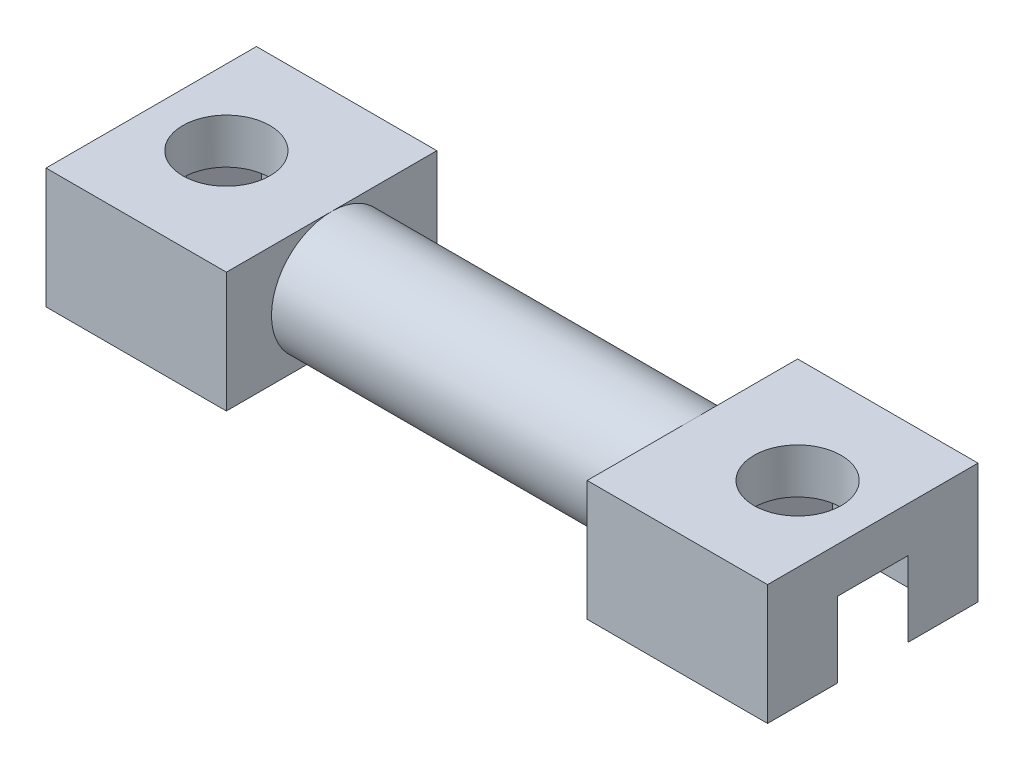
ISO-10303-21;
HEADER;
FILE_DESCRIPTION(('STEP AP214'),'2;1');
FILE_NAME('part.step','',(''),(''),'','','');
FILE_SCHEMA(('AUTOMOTIVE_DESIGN { 1 0 10303 214 1 1 1 1 }'));
ENDSEC;
DATA;
#1=APPLICATION_CONTEXT('core data for automotive mechanical design processes');
#2=APPLICATION_PROTOCOL_DEFINITION('international standard','automotive_design',2000,#1);
#3=PRODUCT_CONTEXT('',#1,'mechanical');
#4=PRODUCT('Part','Part','',(#3));
#5=PRODUCT_RELATED_PRODUCT_CATEGORY('part','',(#4));
#6=PRODUCT_DEFINITION_FORMATION('','',#4);
#7=PRODUCT_DEFINITION_CONTEXT('part definition',#1,'design');
#8=PRODUCT_DEFINITION('design','',#6,#7);
#9=PRODUCT_DEFINITION_SHAPE('','',#8);
#10=(LENGTH_UNIT() NAMED_UNIT(*) SI_UNIT(.MILLI.,.METRE.));
#11=(NAMED_UNIT(*) PLANE_ANGLE_UNIT() SI_UNIT($,.RADIAN.));
#12=(NAMED_UNIT(*) SI_UNIT($,.STERADIAN.) SOLID_ANGLE_UNIT());
#13=UNCERTAINTY_MEASURE_WITH_UNIT(LENGTH_MEASURE(1.E-05),#10,'distance_accuracy_value','');
#14=(GEOMETRIC_REPRESENTATION_CONTEXT(3) GLOBAL_UNCERTAINTY_ASSIGNED_CONTEXT((#13)) GLOBAL_UNIT_ASSIGNED_CONTEXT((#10,
#11,#12)) REPRESENTATION_CONTEXT('',''));
#15=CARTESIAN_POINT('',(0.,0.,0.));
#16=DIRECTION('',(0.,0.,1.));
#17=DIRECTION('',(1.,0.,0.));
#18=AXIS2_PLACEMENT_3D('',#15,#16,#17);
#19=CARTESIAN_POINT('',(0.,4.,0.));
#20=DIRECTION('',(0.,-1.,0.));
#21=DIRECTION('',(0.,0.,-1.));
#22=AXIS2_PLACEMENT_3D('',#19,#20,#21);
#23=PLANE('',#22);
#24=CARTESIAN_POINT('',(-9.5,4.,0.));
#25=DIRECTION('',(0.,1.,0.));
#26=DIRECTION('',(0.,0.,1.));
#27=AXIS2_PLACEMENT_3D('',#24,#25,#26);
#28=CIRCLE('',#27,1.45);
#29=CARTESIAN_POINT('',(-9.5,4.,1.45));
#30=VERTEX_POINT('',#29);
#31=EDGE_CURVE('E384',#30,#30,#28,.T.);
#32=ORIENTED_EDGE('',*,*,#31,.F.);
#33=EDGE_LOOP('',(#32));
#34=FACE_BOUND('',#33,.T.);
#35=DIRECTION('',(0.,0.,1.));
#36=VECTOR('',#35,1.);
#37=CARTESIAN_POINT('',(-6.,4.,0.));
#38=LINE('',#37,#36);
#39=CARTESIAN_POINT('',(-6.,4.,-3.5));
#40=VERTEX_POINT('',#39);
#41=CARTESIAN_POINT('',(-6.,4.,0.));
#42=VERTEX_POINT('',#41);
#43=EDGE_CURVE('E248',#40,#42,#38,.T.);
#44=ORIENTED_EDGE('',*,*,#43,.F.);
#45=DIRECTION('',(-1.,0.,0.));
#46=VECTOR('',#45,1.);
#47=CARTESIAN_POINT('',(-12.,4.,-3.5));
#48=LINE('',#47,#46);
#49=CARTESIAN_POINT('',(-12.,4.,-3.5));
#50=VERTEX_POINT('',#49);
#51=EDGE_CURVE('E392',#40,#50,#48,.T.);
#52=ORIENTED_EDGE('',*,*,#51,.T.);
#53=DIRECTION('',(0.,0.,1.));
#54=VECTOR('',#53,1.);
#55=CARTESIAN_POINT('',(-12.,4.,3.5));
#56=LINE('',#55,#54);
#57=CARTESIAN_POINT('',(-12.,4.,3.5));
#58=VERTEX_POINT('',#57);
#59=EDGE_CURVE('E396',#50,#58,#56,.T.);
#60=ORIENTED_EDGE('',*,*,#59,.T.);
#61=DIRECTION('',(1.,0.,0.));
#62=VECTOR('',#61,1.);
#63=CARTESIAN_POINT('',(-12.,4.,3.5));
#64=LINE('',#63,#62);
#65=CARTESIAN_POINT('',(-6.,4.,3.5));
#66=VERTEX_POINT('',#65);
#67=EDGE_CURVE('E400',#58,#66,#64,.T.);
#68=ORIENTED_EDGE('',*,*,#67,.T.);
#69=EDGE_CURVE('E60',#42,#66,#38,.T.);
#70=ORIENTED_EDGE('',*,*,#69,.F.);
#71=EDGE_LOOP('',(#44,#52,#60,#68,#70));
#72=FACE_BOUND('',#71,.T.);
#73=ADVANCED_FACE('F45',(#34,#72),#23,.F.);
#74=CARTESIAN_POINT('',(0.,0.,0.));
#75=DIRECTION('',(0.,-1.,0.));
#76=DIRECTION('',(0.,0.,-1.));
#77=AXIS2_PLACEMENT_3D('',#74,#75,#76);
#78=PLANE('',#77);
#79=DIRECTION('',(-1.,0.,0.));
#80=VECTOR('',#79,1.);
#81=CARTESIAN_POINT('',(-12.,0.,-3.5));
#82=LINE('',#81,#80);
#83=CARTESIAN_POINT('',(-6.,0.,-3.5));
#84=VERTEX_POINT('',#83);
#85=CARTESIAN_POINT('',(-12.,0.,-3.5));
#86=VERTEX_POINT('',#85);
#87=EDGE_CURVE('E409',#84,#86,#82,.T.);
#88=ORIENTED_EDGE('',*,*,#87,.F.);
#89=DIRECTION('',(0.,0.,1.));
#90=VECTOR('',#89,1.);
#91=CARTESIAN_POINT('',(-6.,0.,0.));
#92=LINE('',#91,#90);
#93=CARTESIAN_POINT('',(-6.,0.,0.));
#94=VERTEX_POINT('',#93);
#95=EDGE_CURVE('E245',#84,#94,#92,.T.);
#96=ORIENTED_EDGE('',*,*,#95,.T.);
#97=CARTESIAN_POINT('',(-6.,0.,3.5));
#98=VERTEX_POINT('',#97);
#99=EDGE_CURVE('E238',#94,#98,#92,.T.);
#100=ORIENTED_EDGE('',*,*,#99,.T.);
#101=DIRECTION('',(1.,0.,0.));
#102=VECTOR('',#101,1.);
#103=CARTESIAN_POINT('',(-12.,0.,3.5));
#104=LINE('',#103,#102);
#105=CARTESIAN_POINT('',(-12.,0.,3.5));
#106=VERTEX_POINT('',#105);
#107=EDGE_CURVE('E393',#106,#98,#104,.T.);
#108=ORIENTED_EDGE('',*,*,#107,.F.);
#109=DIRECTION('',(0.,0.,1.));
#110=VECTOR('',#109,1.);
#111=CARTESIAN_POINT('',(-12.,0.,3.5));
#112=LINE('',#111,#110);
#113=CARTESIAN_POINT('',(-12.,0.,1.16987298107781));
#114=VERTEX_POINT('',#113);
#115=EDGE_CURVE('E414',#114,#106,#112,.T.);
#116=ORIENTED_EDGE('',*,*,#115,.F.);
#117=DIRECTION('',(-0.5,0.,-0.866025403784439));
#118=VECTOR('',#117,1.);
#119=CARTESIAN_POINT('',(-11.0877132402715,0.,2.75));
#120=LINE('',#119,#118);
#121=CARTESIAN_POINT('',(-11.0877132402715,0.,2.75));
#122=VERTEX_POINT('',#121);
#123=EDGE_CURVE('E286',#122,#114,#120,.T.);
#124=ORIENTED_EDGE('',*,*,#123,.F.);
#125=DIRECTION('',(-1.,0.,0.));
#126=VECTOR('',#125,1.);
#127=CARTESIAN_POINT('',(-7.91228675972853,0.,2.75));
#128=LINE('',#127,#126);
#129=CARTESIAN_POINT('',(-7.91228675972853,0.,2.75));
#130=VERTEX_POINT('',#129);
#131=EDGE_CURVE('E281',#130,#122,#128,.T.);
#132=ORIENTED_EDGE('',*,*,#131,.F.);
#133=DIRECTION('',(-0.5,0.,0.866025403784438));
#134=VECTOR('',#133,1.);
#135=CARTESIAN_POINT('',(-6.32457351945706,0.,0.));
#136=LINE('',#135,#134);
#137=CARTESIAN_POINT('',(-6.32457351945706,0.,0.));
#138=VERTEX_POINT('',#137);
#139=EDGE_CURVE('E277',#138,#130,#136,.T.);
#140=ORIENTED_EDGE('',*,*,#139,.F.);
#141=DIRECTION('',(0.5,0.,0.866025403784439));
#142=VECTOR('',#141,1.);
#143=CARTESIAN_POINT('',(-7.91228675972853,0.,-2.75));
#144=LINE('',#143,#142);
#145=CARTESIAN_POINT('',(-7.91228675972853,0.,-2.75));
#146=VERTEX_POINT('',#145);
#147=EDGE_CURVE('E258',#146,#138,#144,.T.);
#148=ORIENTED_EDGE('',*,*,#147,.F.);
#149=DIRECTION('',(1.,0.,0.));
#150=VECTOR('',#149,1.);
#151=CARTESIAN_POINT('',(-11.0877132402715,0.,-2.75));
#152=LINE('',#151,#150);
#153=CARTESIAN_POINT('',(-11.0877132402715,0.,-2.75));
#154=VERTEX_POINT('',#153);
#155=EDGE_CURVE('E292',#154,#146,#152,.T.);
#156=ORIENTED_EDGE('',*,*,#155,.F.);
#157=DIRECTION('',(0.5,0.,-0.866025403784438));
#158=VECTOR('',#157,1.);
#159=CARTESIAN_POINT('',(-12.6754264805429,0.,0.));
#160=LINE('',#159,#158);
#161=CARTESIAN_POINT('',(-12.,0.,-1.16987298107781));
#162=VERTEX_POINT('',#161);
#163=EDGE_CURVE('E289',#162,#154,#160,.T.);
#164=ORIENTED_EDGE('',*,*,#163,.F.);
#165=EDGE_CURVE('E415',#86,#162,#112,.T.);
#166=ORIENTED_EDGE('',*,*,#165,.F.);
#167=EDGE_LOOP('',(#88,#96,#100,#108,#116,#124,#132,#140,#148,#156,#164,#166));
#168=FACE_BOUND('',#167,.T.);
#169=ADVANCED_FACE('F477',(#168),#78,.T.);
#170=CARTESIAN_POINT('',(-12.,4.,-3.5));
#171=DIRECTION('',(0.,0.,1.));
#172=DIRECTION('',(1.,0.,0.));
#173=AXIS2_PLACEMENT_3D('',#170,#171,#172);
#174=PLANE('',#173);
#175=DIRECTION('',(0.,1.,0.));
#176=VECTOR('',#175,1.);
#177=CARTESIAN_POINT('',(-6.,4.,-3.5));
#178=LINE('',#177,#176);
#179=EDGE_CURVE('E249',#84,#40,#178,.T.);
#180=ORIENTED_EDGE('',*,*,#179,.F.);
#181=ORIENTED_EDGE('',*,*,#87,.T.);
#182=DIRECTION('',(0.,-1.,0.));
#183=VECTOR('',#182,1.);
#184=CARTESIAN_POINT('',(-12.,4.,-3.5));
#185=LINE('',#184,#183);
#186=EDGE_CURVE('E430',#50,#86,#185,.T.);
#187=ORIENTED_EDGE('',*,*,#186,.F.);
#188=ORIENTED_EDGE('',*,*,#51,.F.);
#189=EDGE_LOOP('',(#180,#181,#187,#188));
#190=FACE_BOUND('',#189,.T.);
#191=ADVANCED_FACE('F489',(#190),#174,.F.);
#192=CARTESIAN_POINT('',(-12.,4.,3.5));
#193=DIRECTION('',(0.,0.,-1.));
#194=DIRECTION('',(-1.,0.,0.));
#195=AXIS2_PLACEMENT_3D('',#192,#193,#194);
#196=PLANE('',#195);
#197=DIRECTION('',(0.,-1.,0.));
#198=VECTOR('',#197,1.);
#199=CARTESIAN_POINT('',(-6.,4.,3.5));
#200=LINE('',#199,#198);
#201=EDGE_CURVE('E11',#66,#98,#200,.T.);
#202=ORIENTED_EDGE('',*,*,#201,.F.);
#203=ORIENTED_EDGE('',*,*,#67,.F.);
#204=DIRECTION('',(0.,-1.,0.));
#205=VECTOR('',#204,1.);
#206=CARTESIAN_POINT('',(-12.,4.,3.5));
#207=LINE('',#206,#205);
#208=EDGE_CURVE('E426',#58,#106,#207,.T.);
#209=ORIENTED_EDGE('',*,*,#208,.T.);
#210=ORIENTED_EDGE('',*,*,#107,.T.);
#211=EDGE_LOOP('',(#202,#203,#209,#210));
#212=FACE_BOUND('',#211,.T.);
#213=ADVANCED_FACE('F512',(#212),#196,.F.);
#214=CARTESIAN_POINT('',(-9.5,4.,0.));
#215=DIRECTION('',(0.,-1.,0.));
#216=DIRECTION('',(0.,0.,-1.));
#217=AXIS2_PLACEMENT_3D('',#214,#215,#216);
#218=CYLINDRICAL_SURFACE('',#217,1.45);
#219=ORIENTED_EDGE('',*,*,#31,.T.);
#220=EDGE_LOOP('',(#219));
#221=FACE_BOUND('',#220,.T.);
#222=CARTESIAN_POINT('',(-9.5,2.5,0.));
#223=DIRECTION('',(0.,-1.,0.));
#224=DIRECTION('',(0.,0.,-1.));
#225=AXIS2_PLACEMENT_3D('',#222,#223,#224);
#226=CIRCLE('',#225,1.45);
#227=CARTESIAN_POINT('',(-9.5,2.5,-1.45));
#228=VERTEX_POINT('',#227);
#229=EDGE_CURVE('E376',#228,#228,#226,.T.);
#230=ORIENTED_EDGE('',*,*,#229,.T.);
#231=EDGE_LOOP('',(#230));
#232=FACE_BOUND('',#231,.T.);
#233=ADVANCED_FACE('F624',(#221,#232),#218,.F.);
#234=CARTESIAN_POINT('',(-12.,4.,3.5));
#235=DIRECTION('',(1.,0.,0.));
#236=DIRECTION('',(0.,0.,-1.));
#237=AXIS2_PLACEMENT_3D('',#234,#235,#236);
#238=PLANE('',#237);
#239=ORIENTED_EDGE('',*,*,#165,.T.);
#240=DIRECTION('',(0.,1.,0.));
#241=VECTOR('',#240,1.);
#242=CARTESIAN_POINT('',(-12.,4.,-1.16987298107781));
#243=LINE('',#242,#241);
#244=CARTESIAN_POINT('',(-12.,2.5,-1.16987298107781));
#245=VERTEX_POINT('',#244);
#246=EDGE_CURVE('E448',#162,#245,#243,.T.);
#247=ORIENTED_EDGE('',*,*,#246,.T.);
#248=DIRECTION('',(0.,0.,-1.));
#249=VECTOR('',#248,1.);
#250=CARTESIAN_POINT('',(-12.,2.5,3.5));
#251=LINE('',#250,#249);
#252=CARTESIAN_POINT('',(-12.,2.5,1.16987298107781));
#253=VERTEX_POINT('',#252);
#254=EDGE_CURVE('E377',#253,#245,#251,.T.);
#255=ORIENTED_EDGE('',*,*,#254,.F.);
#256=DIRECTION('',(0.,-1.,0.));
#257=VECTOR('',#256,1.);
#258=CARTESIAN_POINT('',(-12.,4.,1.16987298107781));
#259=LINE('',#258,#257);
#260=EDGE_CURVE('E438',#253,#114,#259,.T.);
#261=ORIENTED_EDGE('',*,*,#260,.T.);
#262=ORIENTED_EDGE('',*,*,#115,.T.);
#263=ORIENTED_EDGE('',*,*,#208,.F.);
#264=ORIENTED_EDGE('',*,*,#59,.F.);
#265=ORIENTED_EDGE('',*,*,#186,.T.);
#266=EDGE_LOOP('',(#239,#247,#255,#261,#262,#263,#264,#265));
#267=FACE_BOUND('',#266,.T.);
#268=ADVANCED_FACE('F517',(#267),#238,.F.);
#269=CARTESIAN_POINT('',(-12.6754264805429,2.5,0.));
#270=DIRECTION('',(-0.866025403784438,0.,-0.5));
#271=DIRECTION('',(-0.5,0.,0.866025403784438));
#272=AXIS2_PLACEMENT_3D('',#269,#270,#271);
#273=PLANE('',#272);
#274=ORIENTED_EDGE('',*,*,#163,.T.);
#275=DIRECTION('',(0.,-1.,0.));
#276=VECTOR('',#275,1.);
#277=CARTESIAN_POINT('',(-11.0877132402715,2.5,-2.75));
#278=LINE('',#277,#276);
#279=CARTESIAN_POINT('',(-11.0877132402715,2.5,-2.75));
#280=VERTEX_POINT('',#279);
#281=EDGE_CURVE('E306',#280,#154,#278,.T.);
#282=ORIENTED_EDGE('',*,*,#281,.F.);
#283=DIRECTION('',(0.5,0.,-0.866025403784438));
#284=VECTOR('',#283,1.);
#285=CARTESIAN_POINT('',(-12.6754264805429,2.5,0.));
#286=LINE('',#285,#284);
#287=EDGE_CURVE('E265',#245,#280,#286,.T.);
#288=ORIENTED_EDGE('',*,*,#287,.F.);
#289=ORIENTED_EDGE('',*,*,#246,.F.);
#290=EDGE_LOOP('',(#274,#282,#288,#289));
#291=FACE_BOUND('',#290,.T.);
#292=ADVANCED_FACE('F542',(#291),#273,.F.);
#293=CARTESIAN_POINT('',(-11.0877132402715,2.5,2.75));
#294=DIRECTION('',(-0.866025403784439,0.,0.5));
#295=DIRECTION('',(0.5,0.,0.866025403784439));
#296=AXIS2_PLACEMENT_3D('',#293,#294,#295);
#297=PLANE('',#296);
#298=DIRECTION('',(-0.5,0.,-0.866025403784439));
#299=VECTOR('',#298,1.);
#300=CARTESIAN_POINT('',(-11.0877132402715,2.5,2.75));
#301=LINE('',#300,#299);
#302=CARTESIAN_POINT('',(-11.0877132402715,2.5,2.75));
#303=VERTEX_POINT('',#302);
#304=EDGE_CURVE('E262',#303,#253,#301,.T.);
#305=ORIENTED_EDGE('',*,*,#304,.F.);
#306=DIRECTION('',(0.,-1.,0.));
#307=VECTOR('',#306,1.);
#308=CARTESIAN_POINT('',(-11.0877132402715,2.5,2.75));
#309=LINE('',#308,#307);
#310=EDGE_CURVE('E310',#303,#122,#309,.T.);
#311=ORIENTED_EDGE('',*,*,#310,.T.);
#312=ORIENTED_EDGE('',*,*,#123,.T.);
#313=ORIENTED_EDGE('',*,*,#260,.F.);
#314=EDGE_LOOP('',(#305,#311,#312,#313));
#315=FACE_BOUND('',#314,.T.);
#316=ADVANCED_FACE('F522',(#315),#297,.F.);
#317=CARTESIAN_POINT('',(0.,2.5,0.));
#318=DIRECTION('',(0.,-1.,0.));
#319=DIRECTION('',(0.,0.,-1.));
#320=AXIS2_PLACEMENT_3D('',#317,#318,#319);
#321=PLANE('',#320);
#322=ORIENTED_EDGE('',*,*,#229,.F.);
#323=EDGE_LOOP('',(#322));
#324=FACE_BOUND('',#323,.T.);
#325=ORIENTED_EDGE('',*,*,#254,.T.);
#326=ORIENTED_EDGE('',*,*,#287,.T.);
#327=DIRECTION('',(1.,0.,0.));
#328=VECTOR('',#327,1.);
#329=CARTESIAN_POINT('',(-11.0877132402715,2.5,-2.75));
#330=LINE('',#329,#328);
#331=CARTESIAN_POINT('',(-7.91228675972853,2.5,-2.75));
#332=VERTEX_POINT('',#331);
#333=EDGE_CURVE('E268',#280,#332,#330,.T.);
#334=ORIENTED_EDGE('',*,*,#333,.T.);
#335=DIRECTION('',(0.5,0.,0.866025403784439));
#336=VECTOR('',#335,1.);
#337=CARTESIAN_POINT('',(-7.91228675972853,2.5,-2.75));
#338=LINE('',#337,#336);
#339=CARTESIAN_POINT('',(-6.32457351945706,2.5,0.));
#340=VERTEX_POINT('',#339);
#341=EDGE_CURVE('E272',#332,#340,#338,.T.);
#342=ORIENTED_EDGE('',*,*,#341,.T.);
#343=DIRECTION('',(-0.5,0.,0.866025403784438));
#344=VECTOR('',#343,1.);
#345=CARTESIAN_POINT('',(-6.32457351945706,2.5,0.));
#346=LINE('',#345,#344);
#347=CARTESIAN_POINT('',(-7.91228675972853,2.5,2.75));
#348=VERTEX_POINT('',#347);
#349=EDGE_CURVE('E253',#340,#348,#346,.T.);
#350=ORIENTED_EDGE('',*,*,#349,.T.);
#351=DIRECTION('',(-1.,0.,0.));
#352=VECTOR('',#351,1.);
#353=CARTESIAN_POINT('',(-7.91228675972853,2.5,2.75));
#354=LINE('',#353,#352);
#355=EDGE_CURVE('E257',#348,#303,#354,.T.);
#356=ORIENTED_EDGE('',*,*,#355,.T.);
#357=ORIENTED_EDGE('',*,*,#304,.T.);
#358=EDGE_LOOP('',(#325,#326,#334,#342,#350,#356,#357));
#359=FACE_BOUND('',#358,.T.);
#360=ADVANCED_FACE('F544',(#324,#359),#321,.T.);
#361=CARTESIAN_POINT('',(-6.32457351945706,2.5,0.));
#362=DIRECTION('',(0.866025403784438,0.,0.5));
#363=DIRECTION('',(0.5,0.,-0.866025403784438));
#364=AXIS2_PLACEMENT_3D('',#361,#362,#363);
#365=PLANE('',#364);
#366=ORIENTED_EDGE('',*,*,#139,.T.);
#367=DIRECTION('',(0.,-1.,0.));
#368=VECTOR('',#367,1.);
#369=CARTESIAN_POINT('',(-7.91228675972853,2.5,2.75));
#370=LINE('',#369,#368);
#371=EDGE_CURVE('E276',#348,#130,#370,.T.);
#372=ORIENTED_EDGE('',*,*,#371,.F.);
#373=ORIENTED_EDGE('',*,*,#349,.F.);
#374=DIRECTION('',(0.,-1.,0.));
#375=VECTOR('',#374,1.);
#376=CARTESIAN_POINT('',(-6.32457351945706,2.5,0.));
#377=LINE('',#376,#375);
#378=EDGE_CURVE('E299',#340,#138,#377,.T.);
#379=ORIENTED_EDGE('',*,*,#378,.T.);
#380=EDGE_LOOP('',(#366,#372,#373,#379));
#381=FACE_BOUND('',#380,.T.);
#382=ADVANCED_FACE('F530',(#381),#365,.F.);
#383=CARTESIAN_POINT('',(-7.91228675972853,2.5,-2.75));
#384=DIRECTION('',(0.866025403784439,0.,-0.5));
#385=DIRECTION('',(-0.5,0.,-0.866025403784439));
#386=AXIS2_PLACEMENT_3D('',#383,#384,#385);
#387=PLANE('',#386);
#388=ORIENTED_EDGE('',*,*,#147,.T.);
#389=ORIENTED_EDGE('',*,*,#378,.F.);
#390=ORIENTED_EDGE('',*,*,#341,.F.);
#391=DIRECTION('',(0.,-1.,0.));
#392=VECTOR('',#391,1.);
#393=CARTESIAN_POINT('',(-7.91228675972853,2.5,-2.75));
#394=LINE('',#393,#392);
#395=EDGE_CURVE('E303',#332,#146,#394,.T.);
#396=ORIENTED_EDGE('',*,*,#395,.T.);
#397=EDGE_LOOP('',(#388,#389,#390,#396));
#398=FACE_BOUND('',#397,.T.);
#399=ADVANCED_FACE('F534',(#398),#387,.F.);
#400=CARTESIAN_POINT('',(-11.0877132402715,2.5,-2.75));
#401=DIRECTION('',(0.,0.,-1.));
#402=DIRECTION('',(-1.,0.,0.));
#403=AXIS2_PLACEMENT_3D('',#400,#401,#402);
#404=PLANE('',#403);
#405=ORIENTED_EDGE('',*,*,#155,.T.);
#406=ORIENTED_EDGE('',*,*,#395,.F.);
#407=ORIENTED_EDGE('',*,*,#333,.F.);
#408=ORIENTED_EDGE('',*,*,#281,.T.);
#409=EDGE_LOOP('',(#405,#406,#407,#408));
#410=FACE_BOUND('',#409,.T.);
#411=ADVANCED_FACE('F537',(#410),#404,.F.);
#412=CARTESIAN_POINT('',(-7.91228675972853,2.5,2.75));
#413=DIRECTION('',(0.,0.,1.));
#414=DIRECTION('',(1.,0.,0.));
#415=AXIS2_PLACEMENT_3D('',#412,#413,#414);
#416=PLANE('',#415);
#417=ORIENTED_EDGE('',*,*,#131,.T.);
#418=ORIENTED_EDGE('',*,*,#310,.F.);
#419=ORIENTED_EDGE('',*,*,#355,.F.);
#420=ORIENTED_EDGE('',*,*,#371,.T.);
#421=EDGE_LOOP('',(#417,#418,#419,#420));
#422=FACE_BOUND('',#421,.T.);
#423=ADVANCED_FACE('F525',(#422),#416,.F.);
#424=CARTESIAN_POINT('',(-6.,2.,0.));
#425=DIRECTION('',(1.,0.,0.));
#426=DIRECTION('',(0.,0.,-1.));
#427=AXIS2_PLACEMENT_3D('',#424,#425,#426);
#428=CYLINDRICAL_SURFACE('',#427,2.);
#429=CARTESIAN_POINT('',(6.,2.,0.));
#430=DIRECTION('',(1.,0.,0.));
#431=DIRECTION('',(0.,0.,-1.));
#432=AXIS2_PLACEMENT_3D('',#429,#430,#431);
#433=CIRCLE('',#432,2.);
#434=CARTESIAN_POINT('',(6.,4.,0.));
#435=VERTEX_POINT('',#434);
#436=CARTESIAN_POINT('',(6.,0.,0.));
#437=VERTEX_POINT('',#436);
#438=EDGE_CURVE('E210',#435,#437,#433,.T.);
#439=ORIENTED_EDGE('',*,*,#438,.F.);
#440=EDGE_CURVE('E220',#437,#435,#433,.T.);
#441=ORIENTED_EDGE('',*,*,#440,.F.);
#442=EDGE_LOOP('',(#439,#441));
#443=FACE_BOUND('',#442,.T.);
#444=CARTESIAN_POINT('',(-6.,2.,0.));
#445=DIRECTION('',(1.,0.,0.));
#446=DIRECTION('',(0.,0.,-1.));
#447=AXIS2_PLACEMENT_3D('',#444,#445,#446);
#448=CIRCLE('',#447,2.);
#449=EDGE_CURVE('E230',#94,#42,#448,.T.);
#450=ORIENTED_EDGE('',*,*,#449,.T.);
#451=EDGE_CURVE('E504',#42,#94,#448,.T.);
#452=ORIENTED_EDGE('',*,*,#451,.T.);
#453=EDGE_LOOP('',(#450,#452));
#454=FACE_BOUND('',#453,.T.);
#455=ADVANCED_FACE('F227',(#443,#454),#428,.T.);
#456=CARTESIAN_POINT('',(-6.,0.,0.));
#457=DIRECTION('',(1.,0.,0.));
#458=DIRECTION('',(0.,0.,-1.));
#459=AXIS2_PLACEMENT_3D('',#456,#457,#458);
#460=PLANE('',#459);
#461=ORIENTED_EDGE('',*,*,#179,.T.);
#462=ORIENTED_EDGE('',*,*,#43,.T.);
#463=ORIENTED_EDGE('',*,*,#449,.F.);
#464=ORIENTED_EDGE('',*,*,#95,.F.);
#465=EDGE_LOOP('',(#461,#462,#463,#464));
#466=FACE_BOUND('',#465,.T.);
#467=ADVANCED_FACE('F483',(#466),#460,.T.);
#468=ORIENTED_EDGE('',*,*,#69,.T.);
#469=ORIENTED_EDGE('',*,*,#201,.T.);
#470=ORIENTED_EDGE('',*,*,#99,.F.);
#471=ORIENTED_EDGE('',*,*,#451,.F.);
#472=EDGE_LOOP('',(#468,#469,#470,#471));
#473=FACE_BOUND('',#472,.T.);
#474=ADVANCED_FACE('F508',(#473),#460,.T.);
#475=CARTESIAN_POINT('',(6.,0.,0.));
#476=DIRECTION('',(1.,0.,0.));
#477=DIRECTION('',(0.,0.,-1.));
#478=AXIS2_PLACEMENT_3D('',#475,#476,#477);
#479=PLANE('',#478);
#480=DIRECTION('',(0.,0.,1.));
#481=VECTOR('',#480,1.);
#482=CARTESIAN_POINT('',(6.,0.,0.));
#483=LINE('',#482,#481);
#484=CARTESIAN_POINT('',(6.,0.,-3.5));
#485=VERTEX_POINT('',#484);
#486=EDGE_CURVE('E216',#485,#437,#483,.T.);
#487=ORIENTED_EDGE('',*,*,#486,.T.);
#488=ORIENTED_EDGE('',*,*,#440,.T.);
#489=DIRECTION('',(0.,0.,1.));
#490=VECTOR('',#489,1.);
#491=CARTESIAN_POINT('',(6.,4.,0.));
#492=LINE('',#491,#490);
#493=CARTESIAN_POINT('',(6.,4.,-3.5));
#494=VERTEX_POINT('',#493);
#495=EDGE_CURVE('E215',#494,#435,#492,.T.);
#496=ORIENTED_EDGE('',*,*,#495,.F.);
#497=DIRECTION('',(0.,1.,0.));
#498=VECTOR('',#497,1.);
#499=CARTESIAN_POINT('',(6.,4.,-3.5));
#500=LINE('',#499,#498);
#501=EDGE_CURVE('E236',#485,#494,#500,.T.);
#502=ORIENTED_EDGE('',*,*,#501,.F.);
#503=EDGE_LOOP('',(#487,#488,#496,#502));
#504=FACE_BOUND('',#503,.T.);
#505=ADVANCED_FACE('F221',(#504),#479,.F.);
#506=ORIENTED_EDGE('',*,*,#438,.T.);
#507=CARTESIAN_POINT('',(6.,0.,3.5));
#508=VERTEX_POINT('',#507);
#509=EDGE_CURVE('E68',#437,#508,#483,.T.);
#510=ORIENTED_EDGE('',*,*,#509,.T.);
#511=DIRECTION('',(0.,-1.,0.));
#512=VECTOR('',#511,1.);
#513=CARTESIAN_POINT('',(6.,4.,3.5));
#514=LINE('',#513,#512);
#515=CARTESIAN_POINT('',(6.,4.,3.5));
#516=VERTEX_POINT('',#515);
#517=EDGE_CURVE('E54',#516,#508,#514,.T.);
#518=ORIENTED_EDGE('',*,*,#517,.F.);
#519=EDGE_CURVE('E206',#435,#516,#492,.T.);
#520=ORIENTED_EDGE('',*,*,#519,.F.);
#521=EDGE_LOOP('',(#506,#510,#518,#520));
#522=FACE_BOUND('',#521,.T.);
#523=ADVANCED_FACE('F208',(#522),#479,.F.);
#524=CARTESIAN_POINT('',(0.,2.5,0.));
#525=DIRECTION('',(0.,-1.,0.));
#526=DIRECTION('',(0.,0.,-1.));
#527=AXIS2_PLACEMENT_3D('',#524,#525,#526);
#528=PLANE('',#527);
#529=CARTESIAN_POINT('',(9.5,2.5,0.));
#530=DIRECTION('',(0.,-1.,0.));
#531=DIRECTION('',(0.,0.,-1.));
#532=AXIS2_PLACEMENT_3D('',#529,#530,#531);
#533=CIRCLE('',#532,1.45);
#534=CARTESIAN_POINT('',(9.5,2.5,-1.45));
#535=VERTEX_POINT('',#534);
#536=EDGE_CURVE('E302',#535,#535,#533,.T.);
#537=ORIENTED_EDGE('',*,*,#536,.F.);
#538=EDGE_LOOP('',(#537));
#539=FACE_BOUND('',#538,.T.);
#540=DIRECTION('',(0.,0.,1.));
#541=VECTOR('',#540,1.);
#542=CARTESIAN_POINT('',(12.,2.5,3.5));
#543=LINE('',#542,#541);
#544=CARTESIAN_POINT('',(12.,2.5,-1.16987298107781));
#545=VERTEX_POINT('',#544);
#546=CARTESIAN_POINT('',(12.,2.5,1.1698729810778));
#547=VERTEX_POINT('',#546);
#548=EDGE_CURVE('E373',#545,#547,#543,.T.);
#549=ORIENTED_EDGE('',*,*,#548,.T.);
#550=DIRECTION('',(-0.5,0.,0.866025403784439));
#551=VECTOR('',#550,1.);
#552=CARTESIAN_POINT('',(12.6754264805429,2.5,0.));
#553=LINE('',#552,#551);
#554=CARTESIAN_POINT('',(11.0877132402715,2.5,2.75000000000001));
#555=VERTEX_POINT('',#554);
#556=EDGE_CURVE('E360',#547,#555,#553,.T.);
#557=ORIENTED_EDGE('',*,*,#556,.T.);
#558=DIRECTION('',(-1.,0.,0.));
#559=VECTOR('',#558,1.);
#560=CARTESIAN_POINT('',(11.0877132402715,2.5,2.75000000000001));
#561=LINE('',#560,#559);
#562=CARTESIAN_POINT('',(7.91228675972853,2.5,2.75000000000001));
#563=VERTEX_POINT('',#562);
#564=EDGE_CURVE('E356',#555,#563,#561,.T.);
#565=ORIENTED_EDGE('',*,*,#564,.T.);
#566=DIRECTION('',(-0.5,0.,-0.866025403784439));
#567=VECTOR('',#566,1.);
#568=CARTESIAN_POINT('',(7.91228675972853,2.5,2.75000000000001));
#569=LINE('',#568,#567);
#570=CARTESIAN_POINT('',(6.32457351945705,2.5,0.));
#571=VERTEX_POINT('',#570);
#572=EDGE_CURVE('E318',#563,#571,#569,.T.);
#573=ORIENTED_EDGE('',*,*,#572,.T.);
#574=DIRECTION('',(0.5,0.,-0.866025403784439));
#575=VECTOR('',#574,1.);
#576=CARTESIAN_POINT('',(6.32457351945705,2.5,0.));
#577=LINE('',#576,#575);
#578=CARTESIAN_POINT('',(7.91228675972853,2.5,-2.75));
#579=VERTEX_POINT('',#578);
#580=EDGE_CURVE('E336',#571,#579,#577,.T.);
#581=ORIENTED_EDGE('',*,*,#580,.T.);
#582=DIRECTION('',(1.,0.,0.));
#583=VECTOR('',#582,1.);
#584=CARTESIAN_POINT('',(7.91228675972853,2.5,-2.75));
#585=LINE('',#584,#583);
#586=CARTESIAN_POINT('',(11.0877132402715,2.5,-2.75));
#587=VERTEX_POINT('',#586);
#588=EDGE_CURVE('E366',#579,#587,#585,.T.);
#589=ORIENTED_EDGE('',*,*,#588,.T.);
#590=DIRECTION('',(0.5,0.,0.866025403784439));
#591=VECTOR('',#590,1.);
#592=CARTESIAN_POINT('',(11.0877132402715,2.5,-2.75));
#593=LINE('',#592,#591);
#594=EDGE_CURVE('E363',#587,#545,#593,.T.);
#595=ORIENTED_EDGE('',*,*,#594,.T.);
#596=EDGE_LOOP('',(#549,#557,#565,#573,#581,#589,#595));
#597=FACE_BOUND('',#596,.T.);
#598=ADVANCED_FACE('F578',(#539,#597),#528,.T.);
#599=CARTESIAN_POINT('',(9.5,4.,0.));
#600=DIRECTION('',(0.,-1.,0.));
#601=DIRECTION('',(0.,0.,-1.));
#602=AXIS2_PLACEMENT_3D('',#599,#600,#601);
#603=CYLINDRICAL_SURFACE('',#602,1.45);
#604=CARTESIAN_POINT('',(9.5,4.,0.));
#605=DIRECTION('',(0.,1.,0.));
#606=DIRECTION('',(0.,0.,1.));
#607=AXIS2_PLACEMENT_3D('',#604,#605,#606);
#608=CIRCLE('',#607,1.45);
#609=CARTESIAN_POINT('',(9.5,4.,1.45));
#610=VERTEX_POINT('',#609);
#611=EDGE_CURVE('E380',#610,#610,#608,.T.);
#612=ORIENTED_EDGE('',*,*,#611,.T.);
#613=EDGE_LOOP('',(#612));
#614=FACE_BOUND('',#613,.T.);
#615=ORIENTED_EDGE('',*,*,#536,.T.);
#616=EDGE_LOOP('',(#615));
#617=FACE_BOUND('',#616,.T.);
#618=ADVANCED_FACE('F574',(#614,#617),#603,.F.);
#619=CARTESIAN_POINT('',(12.6754264805429,2.5,0.));
#620=DIRECTION('',(0.866025403784439,0.,0.5));
#621=DIRECTION('',(0.5,0.,-0.866025403784439));
#622=AXIS2_PLACEMENT_3D('',#619,#620,#621);
#623=PLANE('',#622);
#624=DIRECTION('',(-0.5,0.,0.866025403784439));
#625=VECTOR('',#624,1.);
#626=CARTESIAN_POINT('',(12.6754264805429,0.,0.));
#627=LINE('',#626,#625);
#628=CARTESIAN_POINT('',(12.,0.,1.1698729810778));
#629=VERTEX_POINT('',#628);
#630=CARTESIAN_POINT('',(11.0877132402715,0.,2.75000000000001));
#631=VERTEX_POINT('',#630);
#632=EDGE_CURVE('E340',#629,#631,#627,.T.);
#633=ORIENTED_EDGE('',*,*,#632,.T.);
#634=DIRECTION('',(0.,-1.,0.));
#635=VECTOR('',#634,1.);
#636=CARTESIAN_POINT('',(11.0877132402715,2.5,2.75000000000001));
#637=LINE('',#636,#635);
#638=EDGE_CURVE('E322',#555,#631,#637,.T.);
#639=ORIENTED_EDGE('',*,*,#638,.F.);
#640=ORIENTED_EDGE('',*,*,#556,.F.);
#641=DIRECTION('',(0.,1.,0.));
#642=VECTOR('',#641,1.);
#643=CARTESIAN_POINT('',(12.,4.,1.16987298107781));
#644=LINE('',#643,#642);
#645=EDGE_CURVE('E456',#629,#547,#644,.T.);
#646=ORIENTED_EDGE('',*,*,#645,.F.);
#647=EDGE_LOOP('',(#633,#639,#640,#646));
#648=FACE_BOUND('',#647,.T.);
#649=ADVANCED_FACE('F577',(#648),#623,.F.);
#650=CARTESIAN_POINT('',(11.0877132402715,2.5,2.75000000000001));
#651=DIRECTION('',(0.,0.,1.));
#652=DIRECTION('',(1.,0.,0.));
#653=AXIS2_PLACEMENT_3D('',#650,#651,#652);
#654=PLANE('',#653);
#655=DIRECTION('',(-1.,0.,0.));
#656=VECTOR('',#655,1.);
#657=CARTESIAN_POINT('',(11.0877132402715,0.,2.75000000000001));
#658=LINE('',#657,#656);
#659=CARTESIAN_POINT('',(7.91228675972853,0.,2.75000000000001));
#660=VERTEX_POINT('',#659);
#661=EDGE_CURVE('E335',#631,#660,#658,.T.);
#662=ORIENTED_EDGE('',*,*,#661,.T.);
#663=DIRECTION('',(0.,-1.,0.));
#664=VECTOR('',#663,1.);
#665=CARTESIAN_POINT('',(7.91228675972853,2.5,2.75000000000001));
#666=LINE('',#665,#664);
#667=EDGE_CURVE('E326',#563,#660,#666,.T.);
#668=ORIENTED_EDGE('',*,*,#667,.F.);
#669=ORIENTED_EDGE('',*,*,#564,.F.);
#670=ORIENTED_EDGE('',*,*,#638,.T.);
#671=EDGE_LOOP('',(#662,#668,#669,#670));
#672=FACE_BOUND('',#671,.T.);
#673=ADVANCED_FACE('F594',(#672),#654,.F.);
#674=CARTESIAN_POINT('',(7.91228675972853,2.5,2.75000000000001));
#675=DIRECTION('',(-0.866025403784439,0.,0.5));
#676=DIRECTION('',(0.5,0.,0.866025403784439));
#677=AXIS2_PLACEMENT_3D('',#674,#675,#676);
#678=PLANE('',#677);
#679=DIRECTION('',(-0.5,0.,-0.866025403784439));
#680=VECTOR('',#679,1.);
#681=CARTESIAN_POINT('',(7.91228675972853,0.,2.75000000000001));
#682=LINE('',#681,#680);
#683=CARTESIAN_POINT('',(6.32457351945705,0.,0.));
#684=VERTEX_POINT('',#683);
#685=EDGE_CURVE('E331',#660,#684,#682,.T.);
#686=ORIENTED_EDGE('',*,*,#685,.T.);
#687=DIRECTION('',(0.,-1.,0.));
#688=VECTOR('',#687,1.);
#689=CARTESIAN_POINT('',(6.32457351945705,2.5,0.));
#690=LINE('',#689,#688);
#691=EDGE_CURVE('E252',#571,#684,#690,.T.);
#692=ORIENTED_EDGE('',*,*,#691,.F.);
#693=ORIENTED_EDGE('',*,*,#572,.F.);
#694=ORIENTED_EDGE('',*,*,#667,.T.);
#695=EDGE_LOOP('',(#686,#692,#693,#694));
#696=FACE_BOUND('',#695,.T.);
#697=ADVANCED_FACE('F597',(#696),#678,.F.);
#698=CARTESIAN_POINT('',(6.32457351945705,2.5,0.));
#699=DIRECTION('',(-0.866025403784439,0.,-0.5));
#700=DIRECTION('',(-0.5,0.,0.866025403784439));
#701=AXIS2_PLACEMENT_3D('',#698,#699,#700);
#702=PLANE('',#701);
#703=DIRECTION('',(0.5,0.,-0.866025403784439));
#704=VECTOR('',#703,1.);
#705=CARTESIAN_POINT('',(6.32457351945705,0.,0.));
#706=LINE('',#705,#704);
#707=CARTESIAN_POINT('',(7.91228675972853,0.,-2.75));
#708=VERTEX_POINT('',#707);
#709=EDGE_CURVE('E282',#684,#708,#706,.T.);
#710=ORIENTED_EDGE('',*,*,#709,.T.);
#711=DIRECTION('',(0.,-1.,0.));
#712=VECTOR('',#711,1.);
#713=CARTESIAN_POINT('',(7.91228675972853,2.5,-2.75));
#714=LINE('',#713,#712);
#715=EDGE_CURVE('E315',#579,#708,#714,.T.);
#716=ORIENTED_EDGE('',*,*,#715,.F.);
#717=ORIENTED_EDGE('',*,*,#580,.F.);
#718=ORIENTED_EDGE('',*,*,#691,.T.);
#719=EDGE_LOOP('',(#710,#716,#717,#718));
#720=FACE_BOUND('',#719,.T.);
#721=ADVANCED_FACE('F602',(#720),#702,.F.);
#722=CARTESIAN_POINT('',(7.91228675972853,2.5,-2.75));
#723=DIRECTION('',(0.,0.,-1.));
#724=DIRECTION('',(-1.,0.,0.));
#725=AXIS2_PLACEMENT_3D('',#722,#723,#724);
#726=PLANE('',#725);
#727=DIRECTION('',(1.,0.,0.));
#728=VECTOR('',#727,1.);
#729=CARTESIAN_POINT('',(7.91228675972853,0.,-2.75));
#730=LINE('',#729,#728);
#731=CARTESIAN_POINT('',(11.0877132402715,0.,-2.75));
#732=VERTEX_POINT('',#731);
#733=EDGE_CURVE('E346',#708,#732,#730,.T.);
#734=ORIENTED_EDGE('',*,*,#733,.T.);
#735=DIRECTION('',(0.,-1.,0.));
#736=VECTOR('',#735,1.);
#737=CARTESIAN_POINT('',(11.0877132402715,2.5,-2.75));
#738=LINE('',#737,#736);
#739=EDGE_CURVE('E319',#587,#732,#738,.T.);
#740=ORIENTED_EDGE('',*,*,#739,.F.);
#741=ORIENTED_EDGE('',*,*,#588,.F.);
#742=ORIENTED_EDGE('',*,*,#715,.T.);
#743=EDGE_LOOP('',(#734,#740,#741,#742));
#744=FACE_BOUND('',#743,.T.);
#745=ADVANCED_FACE('F605',(#744),#726,.F.);
#746=CARTESIAN_POINT('',(11.0877132402715,2.5,-2.75));
#747=DIRECTION('',(0.866025403784439,0.,-0.5));
#748=DIRECTION('',(-0.5,0.,-0.866025403784439));
#749=AXIS2_PLACEMENT_3D('',#746,#747,#748);
#750=PLANE('',#749);
#751=ORIENTED_EDGE('',*,*,#594,.F.);
#752=ORIENTED_EDGE('',*,*,#739,.T.);
#753=DIRECTION('',(0.5,0.,0.866025403784439));
#754=VECTOR('',#753,1.);
#755=CARTESIAN_POINT('',(11.0877132402715,0.,-2.75));
#756=LINE('',#755,#754);
#757=CARTESIAN_POINT('',(12.,0.,-1.16987298107781));
#758=VERTEX_POINT('',#757);
#759=EDGE_CURVE('E343',#732,#758,#756,.T.);
#760=ORIENTED_EDGE('',*,*,#759,.T.);
#761=DIRECTION('',(0.,-1.,0.));
#762=VECTOR('',#761,1.);
#763=CARTESIAN_POINT('',(12.,4.,-1.16987298107781));
#764=LINE('',#763,#762);
#765=EDGE_CURVE('E452',#545,#758,#764,.T.);
#766=ORIENTED_EDGE('',*,*,#765,.F.);
#767=EDGE_LOOP('',(#751,#752,#760,#766));
#768=FACE_BOUND('',#767,.T.);
#769=ADVANCED_FACE('F609',(#768),#750,.F.);
#770=CARTESIAN_POINT('',(12.,4.,3.5));
#771=DIRECTION('',(-1.,0.,0.));
#772=DIRECTION('',(0.,0.,1.));
#773=AXIS2_PLACEMENT_3D('',#770,#771,#772);
#774=PLANE('',#773);
#775=DIRECTION('',(0.,0.,-1.));
#776=VECTOR('',#775,1.);
#777=CARTESIAN_POINT('',(12.,0.,3.5));
#778=LINE('',#777,#776);
#779=CARTESIAN_POINT('',(12.,0.,3.5));
#780=VERTEX_POINT('',#779);
#781=EDGE_CURVE('E405',#780,#629,#778,.T.);
#782=ORIENTED_EDGE('',*,*,#781,.T.);
#783=ORIENTED_EDGE('',*,*,#645,.T.);
#784=ORIENTED_EDGE('',*,*,#548,.F.);
#785=ORIENTED_EDGE('',*,*,#765,.T.);
#786=CARTESIAN_POINT('',(12.,0.,-3.5));
#787=VERTEX_POINT('',#786);
#788=EDGE_CURVE('E388',#758,#787,#778,.T.);
#789=ORIENTED_EDGE('',*,*,#788,.T.);
#790=DIRECTION('',(0.,-1.,0.));
#791=VECTOR('',#790,1.);
#792=CARTESIAN_POINT('',(12.,4.,-3.5));
#793=LINE('',#792,#791);
#794=CARTESIAN_POINT('',(12.,4.,-3.5));
#795=VERTEX_POINT('',#794);
#796=EDGE_CURVE('E434',#795,#787,#793,.T.);
#797=ORIENTED_EDGE('',*,*,#796,.F.);
#798=DIRECTION('',(0.,0.,-1.));
#799=VECTOR('',#798,1.);
#800=CARTESIAN_POINT('',(12.,4.,3.5));
#801=LINE('',#800,#799);
#802=CARTESIAN_POINT('',(12.,4.,3.5));
#803=VERTEX_POINT('',#802);
#804=EDGE_CURVE('E389',#803,#795,#801,.T.);
#805=ORIENTED_EDGE('',*,*,#804,.F.);
#806=DIRECTION('',(0.,-1.,0.));
#807=VECTOR('',#806,1.);
#808=CARTESIAN_POINT('',(12.,4.,3.5));
#809=LINE('',#808,#807);
#810=EDGE_CURVE('E404',#803,#780,#809,.T.);
#811=ORIENTED_EDGE('',*,*,#810,.T.);
#812=EDGE_LOOP('',(#782,#783,#784,#785,#789,#797,#805,#811));
#813=FACE_BOUND('',#812,.T.);
#814=ADVANCED_FACE('F47',(#813),#774,.F.);
#815=EDGE_CURVE('E399',#516,#803,#64,.T.);
#816=ORIENTED_EDGE('',*,*,#815,.F.);
#817=ORIENTED_EDGE('',*,*,#517,.T.);
#818=EDGE_CURVE('E419',#508,#780,#104,.T.);
#819=ORIENTED_EDGE('',*,*,#818,.T.);
#820=ORIENTED_EDGE('',*,*,#810,.F.);
#821=EDGE_LOOP('',(#816,#817,#819,#820));
#822=FACE_BOUND('',#821,.T.);
#823=ADVANCED_FACE('F462',(#822),#196,.F.);
#824=EDGE_CURVE('E410',#787,#485,#82,.T.);
#825=ORIENTED_EDGE('',*,*,#824,.T.);
#826=ORIENTED_EDGE('',*,*,#501,.T.);
#827=EDGE_CURVE('E234',#795,#494,#48,.T.);
#828=ORIENTED_EDGE('',*,*,#827,.F.);
#829=ORIENTED_EDGE('',*,*,#796,.T.);
#830=EDGE_LOOP('',(#825,#826,#828,#829));
#831=FACE_BOUND('',#830,.T.);
#832=ADVANCED_FACE('F501',(#831),#174,.F.);
#833=ORIENTED_EDGE('',*,*,#486,.F.);
#834=ORIENTED_EDGE('',*,*,#824,.F.);
#835=ORIENTED_EDGE('',*,*,#788,.F.);
#836=ORIENTED_EDGE('',*,*,#759,.F.);
#837=ORIENTED_EDGE('',*,*,#733,.F.);
#838=ORIENTED_EDGE('',*,*,#709,.F.);
#839=ORIENTED_EDGE('',*,*,#685,.F.);
#840=ORIENTED_EDGE('',*,*,#661,.F.);
#841=ORIENTED_EDGE('',*,*,#632,.F.);
#842=ORIENTED_EDGE('',*,*,#781,.F.);
#843=ORIENTED_EDGE('',*,*,#818,.F.);
#844=ORIENTED_EDGE('',*,*,#509,.F.);
#845=EDGE_LOOP('',(#833,#834,#835,#836,#837,#838,#839,#840,#841,#842,#843,#844));
#846=FACE_BOUND('',#845,.T.);
#847=ADVANCED_FACE('F466',(#846),#78,.T.);
#848=ORIENTED_EDGE('',*,*,#611,.F.);
#849=EDGE_LOOP('',(#848));
#850=FACE_BOUND('',#849,.T.);
#851=ORIENTED_EDGE('',*,*,#827,.T.);
#852=ORIENTED_EDGE('',*,*,#495,.T.);
#853=ORIENTED_EDGE('',*,*,#519,.T.);
#854=ORIENTED_EDGE('',*,*,#815,.T.);
#855=ORIENTED_EDGE('',*,*,#804,.T.);
#856=EDGE_LOOP('',(#851,#852,#853,#854,#855));
#857=FACE_BOUND('',#856,.T.);
#858=ADVANCED_FACE('F232',(#850,#857),#23,.F.);
#859=CLOSED_SHELL('',(#73,#169,#191,#213,#233,#268,#292,#316,#360,#382,#399,#411,#423,#455,#467,
#474,#505,#523,#598,#618,#649,#673,#697,#721,#745,#769,#814,#823,#832,#847,#858));
#860=MANIFOLD_SOLID_BREP('B2',#859);
#861=ADVANCED_BREP_SHAPE_REPRESENTATION('',(#18,#860),#14);
#862=SHAPE_DEFINITION_REPRESENTATION(#9,#861);
ENDSEC;
END-ISO-10303-21;
